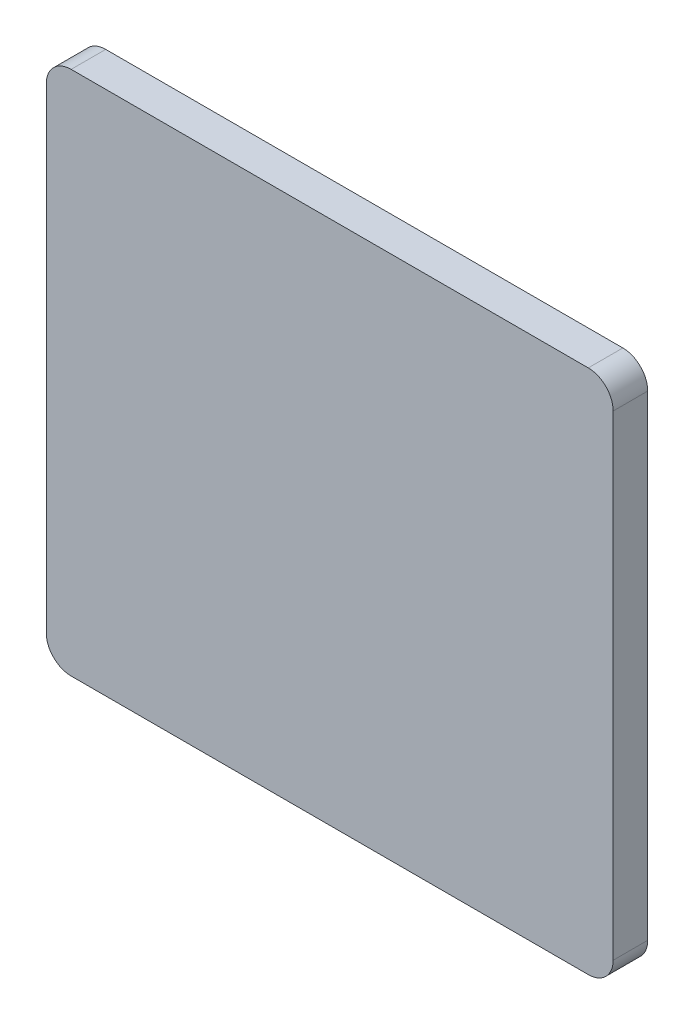
ISO-10303-21;
HEADER;
FILE_DESCRIPTION(('STEP AP214'),'2;1');
FILE_NAME('part.step','',(''),(''),'','','');
FILE_SCHEMA(('AUTOMOTIVE_DESIGN { 1 0 10303 214 1 1 1 1 }'));
ENDSEC;
DATA;
#1=APPLICATION_CONTEXT('core data for automotive mechanical design processes');
#2=APPLICATION_PROTOCOL_DEFINITION('international standard','automotive_design',2000,#1);
#3=PRODUCT_CONTEXT('',#1,'mechanical');
#4=PRODUCT('Part','Part','',(#3));
#5=PRODUCT_RELATED_PRODUCT_CATEGORY('part','',(#4));
#6=PRODUCT_DEFINITION_FORMATION('','',#4);
#7=PRODUCT_DEFINITION_CONTEXT('part definition',#1,'design');
#8=PRODUCT_DEFINITION('design','',#6,#7);
#9=PRODUCT_DEFINITION_SHAPE('','',#8);
#10=(LENGTH_UNIT() NAMED_UNIT(*) SI_UNIT(.MILLI.,.METRE.));
#11=(NAMED_UNIT(*) PLANE_ANGLE_UNIT() SI_UNIT($,.RADIAN.));
#12=(NAMED_UNIT(*) SI_UNIT($,.STERADIAN.) SOLID_ANGLE_UNIT());
#13=UNCERTAINTY_MEASURE_WITH_UNIT(LENGTH_MEASURE(1.E-05),#10,'distance_accuracy_value','');
#14=(GEOMETRIC_REPRESENTATION_CONTEXT(3) GLOBAL_UNCERTAINTY_ASSIGNED_CONTEXT((#13)) GLOBAL_UNIT_ASSIGNED_CONTEXT((#10,
#11,#12)) REPRESENTATION_CONTEXT('',''));
#15=CARTESIAN_POINT('',(0.,0.,0.));
#16=DIRECTION('',(0.,0.,1.));
#17=DIRECTION('',(1.,0.,0.));
#18=AXIS2_PLACEMENT_3D('',#15,#16,#17);
#19=CARTESIAN_POINT('',(-18.7,-17.2,0.));
#20=DIRECTION('',(0.,0.,1.));
#21=DIRECTION('',(1.,0.,0.));
#22=AXIS2_PLACEMENT_3D('',#19,#20,#21);
#23=PLANE('',#22);
#24=CARTESIAN_POINT('',(-18.7,-17.2,0.));
#25=DIRECTION('',(0.,0.,1.));
#26=DIRECTION('',(1.,0.,0.));
#27=AXIS2_PLACEMENT_3D('',#24,#25,#26);
#28=CIRCLE('',#27,1.8);
#29=CARTESIAN_POINT('',(-20.5,-17.2,0.));
#30=VERTEX_POINT('',#29);
#31=CARTESIAN_POINT('',(-18.7,-19.,0.));
#32=VERTEX_POINT('',#31);
#33=EDGE_CURVE('E156',#30,#32,#28,.T.);
#34=ORIENTED_EDGE('',*,*,#33,.F.);
#35=DIRECTION('',(0.,-1.,0.));
#36=VECTOR('',#35,1.);
#37=CARTESIAN_POINT('',(-20.5,17.2,0.));
#38=LINE('',#37,#36);
#39=CARTESIAN_POINT('',(-20.5,17.2,0.));
#40=VERTEX_POINT('',#39);
#41=EDGE_CURVE('E102',#40,#30,#38,.T.);
#42=ORIENTED_EDGE('',*,*,#41,.F.);
#43=CARTESIAN_POINT('',(-18.7,17.2,0.));
#44=DIRECTION('',(0.,0.,1.));
#45=DIRECTION('',(1.,0.,0.));
#46=AXIS2_PLACEMENT_3D('',#43,#44,#45);
#47=CIRCLE('',#46,1.8);
#48=CARTESIAN_POINT('',(-18.7,19.,0.));
#49=VERTEX_POINT('',#48);
#50=EDGE_CURVE('E166',#49,#40,#47,.T.);
#51=ORIENTED_EDGE('',*,*,#50,.F.);
#52=DIRECTION('',(-1.,0.,0.));
#53=VECTOR('',#52,1.);
#54=CARTESIAN_POINT('',(18.7,19.,0.));
#55=LINE('',#54,#53);
#56=CARTESIAN_POINT('',(18.7,19.,0.));
#57=VERTEX_POINT('',#56);
#58=EDGE_CURVE('E145',#57,#49,#55,.T.);
#59=ORIENTED_EDGE('',*,*,#58,.F.);
#60=CARTESIAN_POINT('',(18.7,17.2,0.));
#61=DIRECTION('',(0.,0.,1.));
#62=DIRECTION('',(1.,0.,0.));
#63=AXIS2_PLACEMENT_3D('',#60,#61,#62);
#64=CIRCLE('',#63,1.8);
#65=CARTESIAN_POINT('',(20.5,17.2,0.));
#66=VERTEX_POINT('',#65);
#67=EDGE_CURVE('E167',#66,#57,#64,.T.);
#68=ORIENTED_EDGE('',*,*,#67,.F.);
#69=DIRECTION('',(0.,1.,0.));
#70=VECTOR('',#69,1.);
#71=CARTESIAN_POINT('',(20.5,-17.2,0.));
#72=LINE('',#71,#70);
#73=CARTESIAN_POINT('',(20.5,-17.2,0.));
#74=VERTEX_POINT('',#73);
#75=EDGE_CURVE('E163',#74,#66,#72,.T.);
#76=ORIENTED_EDGE('',*,*,#75,.F.);
#77=CARTESIAN_POINT('',(18.7,-17.2,0.));
#78=DIRECTION('',(0.,0.,1.));
#79=DIRECTION('',(1.,0.,0.));
#80=AXIS2_PLACEMENT_3D('',#77,#78,#79);
#81=CIRCLE('',#80,1.8);
#82=CARTESIAN_POINT('',(18.7,-19.,0.));
#83=VERTEX_POINT('',#82);
#84=EDGE_CURVE('E165',#83,#74,#81,.T.);
#85=ORIENTED_EDGE('',*,*,#84,.F.);
#86=DIRECTION('',(1.,0.,0.));
#87=VECTOR('',#86,1.);
#88=CARTESIAN_POINT('',(-18.7,-19.,0.));
#89=LINE('',#88,#87);
#90=EDGE_CURVE('E157',#32,#83,#89,.T.);
#91=ORIENTED_EDGE('',*,*,#90,.F.);
#92=EDGE_LOOP('',(#34,#42,#51,#59,#68,#76,#85,#91));
#93=FACE_BOUND('',#92,.T.);
#94=CARTESIAN_POINT('',(-17.4,-15.9,0.));
#95=DIRECTION('',(0.,0.,1.));
#96=DIRECTION('',(1.,0.,0.));
#97=AXIS2_PLACEMENT_3D('',#94,#95,#96);
#98=CIRCLE('',#97,1.00000000000001);
#99=CARTESIAN_POINT('',(-18.4,-15.9,0.));
#100=VERTEX_POINT('',#99);
#101=CARTESIAN_POINT('',(-17.4,-16.9,0.));
#102=VERTEX_POINT('',#101);
#103=EDGE_CURVE('E64',#100,#102,#98,.T.);
#104=ORIENTED_EDGE('',*,*,#103,.T.);
#105=DIRECTION('',(1.,0.,0.));
#106=VECTOR('',#105,1.);
#107=CARTESIAN_POINT('',(-17.4,-16.9,0.));
#108=LINE('',#107,#106);
#109=CARTESIAN_POINT('',(17.4,-16.9,0.));
#110=VERTEX_POINT('',#109);
#111=EDGE_CURVE('E246',#102,#110,#108,.T.);
#112=ORIENTED_EDGE('',*,*,#111,.T.);
#113=CARTESIAN_POINT('',(17.4,-15.9,0.));
#114=DIRECTION('',(0.,0.,1.));
#115=DIRECTION('',(1.,0.,0.));
#116=AXIS2_PLACEMENT_3D('',#113,#114,#115);
#117=CIRCLE('',#116,1.00000000000001);
#118=CARTESIAN_POINT('',(18.4,-15.9,0.));
#119=VERTEX_POINT('',#118);
#120=EDGE_CURVE('E245',#110,#119,#117,.T.);
#121=ORIENTED_EDGE('',*,*,#120,.T.);
#122=DIRECTION('',(0.,1.,0.));
#123=VECTOR('',#122,1.);
#124=CARTESIAN_POINT('',(18.4,-15.9,0.));
#125=LINE('',#124,#123);
#126=CARTESIAN_POINT('',(18.4,15.9,0.));
#127=VERTEX_POINT('',#126);
#128=EDGE_CURVE('E238',#119,#127,#125,.T.);
#129=ORIENTED_EDGE('',*,*,#128,.T.);
#130=CARTESIAN_POINT('',(17.4,15.9,0.));
#131=DIRECTION('',(0.,0.,1.));
#132=DIRECTION('',(1.,0.,0.));
#133=AXIS2_PLACEMENT_3D('',#130,#131,#132);
#134=CIRCLE('',#133,1.00000000000001);
#135=CARTESIAN_POINT('',(17.4,16.9,0.));
#136=VERTEX_POINT('',#135);
#137=EDGE_CURVE('E240',#127,#136,#134,.T.);
#138=ORIENTED_EDGE('',*,*,#137,.T.);
#139=DIRECTION('',(-1.,0.,0.));
#140=VECTOR('',#139,1.);
#141=CARTESIAN_POINT('',(17.4,16.9,0.));
#142=LINE('',#141,#140);
#143=CARTESIAN_POINT('',(-17.4,16.9,0.));
#144=VERTEX_POINT('',#143);
#145=EDGE_CURVE('E233',#136,#144,#142,.T.);
#146=ORIENTED_EDGE('',*,*,#145,.T.);
#147=CARTESIAN_POINT('',(-17.4,15.9,0.));
#148=DIRECTION('',(0.,0.,1.));
#149=DIRECTION('',(1.,0.,0.));
#150=AXIS2_PLACEMENT_3D('',#147,#148,#149);
#151=CIRCLE('',#150,1.00000000000001);
#152=CARTESIAN_POINT('',(-18.4,15.9,0.));
#153=VERTEX_POINT('',#152);
#154=EDGE_CURVE('E231',#144,#153,#151,.T.);
#155=ORIENTED_EDGE('',*,*,#154,.T.);
#156=DIRECTION('',(0.,-1.,0.));
#157=VECTOR('',#156,1.);
#158=CARTESIAN_POINT('',(-18.4,15.9,0.));
#159=LINE('',#158,#157);
#160=EDGE_CURVE('E229',#153,#100,#159,.T.);
#161=ORIENTED_EDGE('',*,*,#160,.T.);
#162=EDGE_LOOP('',(#104,#112,#121,#129,#138,#146,#155,#161));
#163=FACE_BOUND('',#162,.T.);
#164=ADVANCED_FACE('F50',(#93,#163),#23,.F.);
#165=CARTESIAN_POINT('',(-18.7,-17.2,2.5));
#166=DIRECTION('',(0.,0.,-1.));
#167=DIRECTION('',(-1.,0.,0.));
#168=AXIS2_PLACEMENT_3D('',#165,#166,#167);
#169=CYLINDRICAL_SURFACE('',#168,1.8);
#170=ORIENTED_EDGE('',*,*,#33,.T.);
#171=DIRECTION('',(0.,0.,-1.));
#172=VECTOR('',#171,1.);
#173=CARTESIAN_POINT('',(-18.7,-19.,2.5));
#174=LINE('',#173,#172);
#175=CARTESIAN_POINT('',(-18.7,-19.,2.5));
#176=VERTEX_POINT('',#175);
#177=EDGE_CURVE('E11',#176,#32,#174,.T.);
#178=ORIENTED_EDGE('',*,*,#177,.F.);
#179=CARTESIAN_POINT('',(-18.7,-17.2,2.5));
#180=DIRECTION('',(0.,0.,1.));
#181=DIRECTION('',(1.,0.,0.));
#182=AXIS2_PLACEMENT_3D('',#179,#180,#181);
#183=CIRCLE('',#182,1.8);
#184=CARTESIAN_POINT('',(-20.5,-17.2,2.5));
#185=VERTEX_POINT('',#184);
#186=EDGE_CURVE('E174',#185,#176,#183,.T.);
#187=ORIENTED_EDGE('',*,*,#186,.F.);
#188=DIRECTION('',(0.,0.,-1.));
#189=VECTOR('',#188,1.);
#190=CARTESIAN_POINT('',(-20.5,-17.2,2.5));
#191=LINE('',#190,#189);
#192=EDGE_CURVE('E155',#185,#30,#191,.T.);
#193=ORIENTED_EDGE('',*,*,#192,.T.);
#194=EDGE_LOOP('',(#170,#178,#187,#193));
#195=FACE_BOUND('',#194,.T.);
#196=ADVANCED_FACE('F47',(#195),#169,.T.);
#197=CARTESIAN_POINT('',(-18.7,-19.,2.5));
#198=DIRECTION('',(0.,1.,0.));
#199=DIRECTION('',(0.,0.,1.));
#200=AXIS2_PLACEMENT_3D('',#197,#198,#199);
#201=PLANE('',#200);
#202=ORIENTED_EDGE('',*,*,#90,.T.);
#203=DIRECTION('',(0.,0.,-1.));
#204=VECTOR('',#203,1.);
#205=CARTESIAN_POINT('',(18.7,-19.,2.5));
#206=LINE('',#205,#204);
#207=CARTESIAN_POINT('',(18.7,-19.,2.5));
#208=VERTEX_POINT('',#207);
#209=EDGE_CURVE('E54',#208,#83,#206,.T.);
#210=ORIENTED_EDGE('',*,*,#209,.F.);
#211=DIRECTION('',(1.,0.,0.));
#212=VECTOR('',#211,1.);
#213=CARTESIAN_POINT('',(-18.7,-19.,2.5));
#214=LINE('',#213,#212);
#215=EDGE_CURVE('E115',#176,#208,#214,.T.);
#216=ORIENTED_EDGE('',*,*,#215,.F.);
#217=ORIENTED_EDGE('',*,*,#177,.T.);
#218=EDGE_LOOP('',(#202,#210,#216,#217));
#219=FACE_BOUND('',#218,.T.);
#220=ADVANCED_FACE('F349',(#219),#201,.F.);
#221=CARTESIAN_POINT('',(18.7,-17.2,2.5));
#222=DIRECTION('',(0.,0.,-1.));
#223=DIRECTION('',(-1.,0.,0.));
#224=AXIS2_PLACEMENT_3D('',#221,#222,#223);
#225=CYLINDRICAL_SURFACE('',#224,1.8);
#226=ORIENTED_EDGE('',*,*,#84,.T.);
#227=DIRECTION('',(0.,0.,-1.));
#228=VECTOR('',#227,1.);
#229=CARTESIAN_POINT('',(20.5,-17.2,2.5));
#230=LINE('',#229,#228);
#231=CARTESIAN_POINT('',(20.5,-17.2,2.5));
#232=VERTEX_POINT('',#231);
#233=EDGE_CURVE('E178',#232,#74,#230,.T.);
#234=ORIENTED_EDGE('',*,*,#233,.F.);
#235=CARTESIAN_POINT('',(18.7,-17.2,2.5));
#236=DIRECTION('',(0.,0.,1.));
#237=DIRECTION('',(1.,0.,0.));
#238=AXIS2_PLACEMENT_3D('',#235,#236,#237);
#239=CIRCLE('',#238,1.8);
#240=EDGE_CURVE('E189',#208,#232,#239,.T.);
#241=ORIENTED_EDGE('',*,*,#240,.F.);
#242=ORIENTED_EDGE('',*,*,#209,.T.);
#243=EDGE_LOOP('',(#226,#234,#241,#242));
#244=FACE_BOUND('',#243,.T.);
#245=ADVANCED_FACE('F183',(#244),#225,.T.);
#246=CARTESIAN_POINT('',(20.5,-17.2,2.5));
#247=DIRECTION('',(-1.,0.,0.));
#248=DIRECTION('',(0.,0.,1.));
#249=AXIS2_PLACEMENT_3D('',#246,#247,#248);
#250=PLANE('',#249);
#251=ORIENTED_EDGE('',*,*,#75,.T.);
#252=DIRECTION('',(0.,0.,-1.));
#253=VECTOR('',#252,1.);
#254=CARTESIAN_POINT('',(20.5,17.2,2.5));
#255=LINE('',#254,#253);
#256=CARTESIAN_POINT('',(20.5,17.2,2.5));
#257=VERTEX_POINT('',#256);
#258=EDGE_CURVE('E176',#257,#66,#255,.T.);
#259=ORIENTED_EDGE('',*,*,#258,.F.);
#260=DIRECTION('',(0.,1.,0.));
#261=VECTOR('',#260,1.);
#262=CARTESIAN_POINT('',(20.5,-17.2,2.5));
#263=LINE('',#262,#261);
#264=EDGE_CURVE('E200',#232,#257,#263,.T.);
#265=ORIENTED_EDGE('',*,*,#264,.F.);
#266=ORIENTED_EDGE('',*,*,#233,.T.);
#267=EDGE_LOOP('',(#251,#259,#265,#266));
#268=FACE_BOUND('',#267,.T.);
#269=ADVANCED_FACE('F195',(#268),#250,.F.);
#270=CARTESIAN_POINT('',(18.7,17.2,2.5));
#271=DIRECTION('',(0.,0.,-1.));
#272=DIRECTION('',(-1.,0.,0.));
#273=AXIS2_PLACEMENT_3D('',#270,#271,#272);
#274=CYLINDRICAL_SURFACE('',#273,1.8);
#275=ORIENTED_EDGE('',*,*,#67,.T.);
#276=DIRECTION('',(0.,0.,-1.));
#277=VECTOR('',#276,1.);
#278=CARTESIAN_POINT('',(18.7,19.,2.5));
#279=LINE('',#278,#277);
#280=CARTESIAN_POINT('',(18.7,19.,2.5));
#281=VERTEX_POINT('',#280);
#282=EDGE_CURVE('E150',#281,#57,#279,.T.);
#283=ORIENTED_EDGE('',*,*,#282,.F.);
#284=CARTESIAN_POINT('',(18.7,17.2,2.5));
#285=DIRECTION('',(0.,0.,1.));
#286=DIRECTION('',(1.,0.,0.));
#287=AXIS2_PLACEMENT_3D('',#284,#285,#286);
#288=CIRCLE('',#287,1.8);
#289=EDGE_CURVE('E133',#257,#281,#288,.T.);
#290=ORIENTED_EDGE('',*,*,#289,.F.);
#291=ORIENTED_EDGE('',*,*,#258,.T.);
#292=EDGE_LOOP('',(#275,#283,#290,#291));
#293=FACE_BOUND('',#292,.T.);
#294=ADVANCED_FACE('F196',(#293),#274,.T.);
#295=CARTESIAN_POINT('',(18.7,19.,2.5));
#296=DIRECTION('',(0.,-1.,0.));
#297=DIRECTION('',(0.,0.,-1.));
#298=AXIS2_PLACEMENT_3D('',#295,#296,#297);
#299=PLANE('',#298);
#300=ORIENTED_EDGE('',*,*,#58,.T.);
#301=DIRECTION('',(0.,0.,-1.));
#302=VECTOR('',#301,1.);
#303=CARTESIAN_POINT('',(-18.7,19.,2.5));
#304=LINE('',#303,#302);
#305=CARTESIAN_POINT('',(-18.7,19.,2.5));
#306=VERTEX_POINT('',#305);
#307=EDGE_CURVE('E143',#306,#49,#304,.T.);
#308=ORIENTED_EDGE('',*,*,#307,.F.);
#309=DIRECTION('',(-1.,0.,0.));
#310=VECTOR('',#309,1.);
#311=CARTESIAN_POINT('',(18.7,19.,2.5));
#312=LINE('',#311,#310);
#313=EDGE_CURVE('E126',#281,#306,#312,.T.);
#314=ORIENTED_EDGE('',*,*,#313,.F.);
#315=ORIENTED_EDGE('',*,*,#282,.T.);
#316=EDGE_LOOP('',(#300,#308,#314,#315));
#317=FACE_BOUND('',#316,.T.);
#318=ADVANCED_FACE('F142',(#317),#299,.F.);
#319=CARTESIAN_POINT('',(-18.7,17.2,2.5));
#320=DIRECTION('',(0.,0.,-1.));
#321=DIRECTION('',(-1.,0.,0.));
#322=AXIS2_PLACEMENT_3D('',#319,#320,#321);
#323=CYLINDRICAL_SURFACE('',#322,1.8);
#324=ORIENTED_EDGE('',*,*,#50,.T.);
#325=DIRECTION('',(0.,0.,-1.));
#326=VECTOR('',#325,1.);
#327=CARTESIAN_POINT('',(-20.5,17.2,2.5));
#328=LINE('',#327,#326);
#329=CARTESIAN_POINT('',(-20.5,17.2,2.5));
#330=VERTEX_POINT('',#329);
#331=EDGE_CURVE('E146',#330,#40,#328,.T.);
#332=ORIENTED_EDGE('',*,*,#331,.F.);
#333=CARTESIAN_POINT('',(-18.7,17.2,2.5));
#334=DIRECTION('',(0.,0.,1.));
#335=DIRECTION('',(1.,0.,0.));
#336=AXIS2_PLACEMENT_3D('',#333,#334,#335);
#337=CIRCLE('',#336,1.8);
#338=EDGE_CURVE('E134',#306,#330,#337,.T.);
#339=ORIENTED_EDGE('',*,*,#338,.F.);
#340=ORIENTED_EDGE('',*,*,#307,.T.);
#341=EDGE_LOOP('',(#324,#332,#339,#340));
#342=FACE_BOUND('',#341,.T.);
#343=ADVANCED_FACE('F147',(#342),#323,.T.);
#344=CARTESIAN_POINT('',(-20.5,17.2,2.5));
#345=DIRECTION('',(1.,0.,0.));
#346=DIRECTION('',(0.,0.,-1.));
#347=AXIS2_PLACEMENT_3D('',#344,#345,#346);
#348=PLANE('',#347);
#349=ORIENTED_EDGE('',*,*,#41,.T.);
#350=ORIENTED_EDGE('',*,*,#192,.F.);
#351=DIRECTION('',(0.,-1.,0.));
#352=VECTOR('',#351,1.);
#353=CARTESIAN_POINT('',(-20.5,17.2,2.5));
#354=LINE('',#353,#352);
#355=EDGE_CURVE('E72',#330,#185,#354,.T.);
#356=ORIENTED_EDGE('',*,*,#355,.F.);
#357=ORIENTED_EDGE('',*,*,#331,.T.);
#358=EDGE_LOOP('',(#349,#350,#356,#357));
#359=FACE_BOUND('',#358,.T.);
#360=ADVANCED_FACE('F351',(#359),#348,.F.);
#361=CARTESIAN_POINT('',(-18.7,-17.2,2.5));
#362=DIRECTION('',(0.,0.,1.));
#363=DIRECTION('',(1.,0.,0.));
#364=AXIS2_PLACEMENT_3D('',#361,#362,#363);
#365=PLANE('',#364);
#366=ORIENTED_EDGE('',*,*,#186,.T.);
#367=ORIENTED_EDGE('',*,*,#215,.T.);
#368=ORIENTED_EDGE('',*,*,#240,.T.);
#369=ORIENTED_EDGE('',*,*,#264,.T.);
#370=ORIENTED_EDGE('',*,*,#289,.T.);
#371=ORIENTED_EDGE('',*,*,#313,.T.);
#372=ORIENTED_EDGE('',*,*,#338,.T.);
#373=ORIENTED_EDGE('',*,*,#355,.T.);
#374=EDGE_LOOP('',(#366,#367,#368,#369,#370,#371,#372,#373));
#375=FACE_BOUND('',#374,.T.);
#376=ADVANCED_FACE('F128',(#375),#365,.T.);
#377=CARTESIAN_POINT('',(-17.4,-15.9,0.7));
#378=DIRECTION('',(0.,0.,-1.));
#379=DIRECTION('',(-1.,0.,0.));
#380=AXIS2_PLACEMENT_3D('',#377,#378,#379);
#381=CYLINDRICAL_SURFACE('',#380,1.00000000000001);
#382=ORIENTED_EDGE('',*,*,#103,.F.);
#383=DIRECTION('',(0.,0.,-1.));
#384=VECTOR('',#383,1.);
#385=CARTESIAN_POINT('',(-18.4,-15.9,0.7));
#386=LINE('',#385,#384);
#387=CARTESIAN_POINT('',(-18.4,-15.9,0.7));
#388=VERTEX_POINT('',#387);
#389=EDGE_CURVE('E221',#388,#100,#386,.T.);
#390=ORIENTED_EDGE('',*,*,#389,.F.);
#391=CARTESIAN_POINT('',(-17.4,-15.9,0.7));
#392=DIRECTION('',(0.,0.,1.));
#393=DIRECTION('',(1.,0.,0.));
#394=AXIS2_PLACEMENT_3D('',#391,#392,#393);
#395=CIRCLE('',#394,1.00000000000001);
#396=CARTESIAN_POINT('',(-17.4,-16.9,0.7));
#397=VERTEX_POINT('',#396);
#398=EDGE_CURVE('E228',#388,#397,#395,.T.);
#399=ORIENTED_EDGE('',*,*,#398,.T.);
#400=DIRECTION('',(0.,0.,-1.));
#401=VECTOR('',#400,1.);
#402=CARTESIAN_POINT('',(-17.4,-16.9,0.7));
#403=LINE('',#402,#401);
#404=EDGE_CURVE('E159',#397,#102,#403,.T.);
#405=ORIENTED_EDGE('',*,*,#404,.T.);
#406=EDGE_LOOP('',(#382,#390,#399,#405));
#407=FACE_BOUND('',#406,.T.);
#408=ADVANCED_FACE('F273',(#407),#381,.F.);
#409=CARTESIAN_POINT('',(-17.4,-16.9,0.7));
#410=DIRECTION('',(0.,1.,0.));
#411=DIRECTION('',(0.,0.,1.));
#412=AXIS2_PLACEMENT_3D('',#409,#410,#411);
#413=PLANE('',#412);
#414=ORIENTED_EDGE('',*,*,#111,.F.);
#415=ORIENTED_EDGE('',*,*,#404,.F.);
#416=DIRECTION('',(1.,0.,0.));
#417=VECTOR('',#416,1.);
#418=CARTESIAN_POINT('',(-17.4,-16.9,0.7));
#419=LINE('',#418,#417);
#420=CARTESIAN_POINT('',(17.4,-16.9,0.7));
#421=VERTEX_POINT('',#420);
#422=EDGE_CURVE('E270',#397,#421,#419,.T.);
#423=ORIENTED_EDGE('',*,*,#422,.T.);
#424=DIRECTION('',(0.,0.,-1.));
#425=VECTOR('',#424,1.);
#426=CARTESIAN_POINT('',(17.4,-16.9,0.7));
#427=LINE('',#426,#425);
#428=EDGE_CURVE('E206',#421,#110,#427,.T.);
#429=ORIENTED_EDGE('',*,*,#428,.T.);
#430=EDGE_LOOP('',(#414,#415,#423,#429));
#431=FACE_BOUND('',#430,.T.);
#432=ADVANCED_FACE('F285',(#431),#413,.T.);
#433=CARTESIAN_POINT('',(17.4,-15.9,0.7));
#434=DIRECTION('',(0.,0.,-1.));
#435=DIRECTION('',(-1.,0.,0.));
#436=AXIS2_PLACEMENT_3D('',#433,#434,#435);
#437=CYLINDRICAL_SURFACE('',#436,1.00000000000001);
#438=ORIENTED_EDGE('',*,*,#120,.F.);
#439=ORIENTED_EDGE('',*,*,#428,.F.);
#440=CARTESIAN_POINT('',(17.4,-15.9,0.7));
#441=DIRECTION('',(0.,0.,1.));
#442=DIRECTION('',(1.,0.,0.));
#443=AXIS2_PLACEMENT_3D('',#440,#441,#442);
#444=CIRCLE('',#443,1.00000000000001);
#445=CARTESIAN_POINT('',(18.4,-15.9,0.7));
#446=VERTEX_POINT('',#445);
#447=EDGE_CURVE('E262',#421,#446,#444,.T.);
#448=ORIENTED_EDGE('',*,*,#447,.T.);
#449=DIRECTION('',(0.,0.,-1.));
#450=VECTOR('',#449,1.);
#451=CARTESIAN_POINT('',(18.4,-15.9,0.7));
#452=LINE('',#451,#450);
#453=EDGE_CURVE('E207',#446,#119,#452,.T.);
#454=ORIENTED_EDGE('',*,*,#453,.T.);
#455=EDGE_LOOP('',(#438,#439,#448,#454));
#456=FACE_BOUND('',#455,.T.);
#457=ADVANCED_FACE('F329',(#456),#437,.F.);
#458=CARTESIAN_POINT('',(18.4,-15.9,0.7));
#459=DIRECTION('',(-1.,0.,0.));
#460=DIRECTION('',(0.,0.,1.));
#461=AXIS2_PLACEMENT_3D('',#458,#459,#460);
#462=PLANE('',#461);
#463=ORIENTED_EDGE('',*,*,#128,.F.);
#464=ORIENTED_EDGE('',*,*,#453,.F.);
#465=DIRECTION('',(0.,1.,0.));
#466=VECTOR('',#465,1.);
#467=CARTESIAN_POINT('',(18.4,-15.9,0.7));
#468=LINE('',#467,#466);
#469=CARTESIAN_POINT('',(18.4,15.9,0.7));
#470=VERTEX_POINT('',#469);
#471=EDGE_CURVE('E261',#446,#470,#468,.T.);
#472=ORIENTED_EDGE('',*,*,#471,.T.);
#473=DIRECTION('',(0.,0.,-1.));
#474=VECTOR('',#473,1.);
#475=CARTESIAN_POINT('',(18.4,15.9,0.7));
#476=LINE('',#475,#474);
#477=EDGE_CURVE('E215',#470,#127,#476,.T.);
#478=ORIENTED_EDGE('',*,*,#477,.T.);
#479=EDGE_LOOP('',(#463,#464,#472,#478));
#480=FACE_BOUND('',#479,.T.);
#481=ADVANCED_FACE('F334',(#480),#462,.T.);
#482=CARTESIAN_POINT('',(17.4,15.9,0.7));
#483=DIRECTION('',(0.,0.,-1.));
#484=DIRECTION('',(-1.,0.,0.));
#485=AXIS2_PLACEMENT_3D('',#482,#483,#484);
#486=CYLINDRICAL_SURFACE('',#485,1.00000000000001);
#487=ORIENTED_EDGE('',*,*,#137,.F.);
#488=ORIENTED_EDGE('',*,*,#477,.F.);
#489=CARTESIAN_POINT('',(17.4,15.9,0.7));
#490=DIRECTION('',(0.,0.,1.));
#491=DIRECTION('',(1.,0.,0.));
#492=AXIS2_PLACEMENT_3D('',#489,#490,#491);
#493=CIRCLE('',#492,1.00000000000001);
#494=CARTESIAN_POINT('',(17.4,16.9,0.7));
#495=VERTEX_POINT('',#494);
#496=EDGE_CURVE('E256',#470,#495,#493,.T.);
#497=ORIENTED_EDGE('',*,*,#496,.T.);
#498=DIRECTION('',(0.,0.,-1.));
#499=VECTOR('',#498,1.);
#500=CARTESIAN_POINT('',(17.4,16.9,0.7));
#501=LINE('',#500,#499);
#502=EDGE_CURVE('E214',#495,#136,#501,.T.);
#503=ORIENTED_EDGE('',*,*,#502,.T.);
#504=EDGE_LOOP('',(#487,#488,#497,#503));
#505=FACE_BOUND('',#504,.T.);
#506=ADVANCED_FACE('F333',(#505),#486,.F.);
#507=CARTESIAN_POINT('',(17.4,16.9,0.7));
#508=DIRECTION('',(0.,-1.,0.));
#509=DIRECTION('',(0.,0.,-1.));
#510=AXIS2_PLACEMENT_3D('',#507,#508,#509);
#511=PLANE('',#510);
#512=ORIENTED_EDGE('',*,*,#145,.F.);
#513=ORIENTED_EDGE('',*,*,#502,.F.);
#514=DIRECTION('',(-1.,0.,0.));
#515=VECTOR('',#514,1.);
#516=CARTESIAN_POINT('',(17.4,16.9,0.7));
#517=LINE('',#516,#515);
#518=CARTESIAN_POINT('',(-17.4,16.9,0.7));
#519=VERTEX_POINT('',#518);
#520=EDGE_CURVE('E254',#495,#519,#517,.T.);
#521=ORIENTED_EDGE('',*,*,#520,.T.);
#522=DIRECTION('',(0.,0.,-1.));
#523=VECTOR('',#522,1.);
#524=CARTESIAN_POINT('',(-17.4,16.9,0.7));
#525=LINE('',#524,#523);
#526=EDGE_CURVE('E217',#519,#144,#525,.T.);
#527=ORIENTED_EDGE('',*,*,#526,.T.);
#528=EDGE_LOOP('',(#512,#513,#521,#527));
#529=FACE_BOUND('',#528,.T.);
#530=ADVANCED_FACE('F313',(#529),#511,.T.);
#531=CARTESIAN_POINT('',(-17.4,15.9,0.7));
#532=DIRECTION('',(0.,0.,-1.));
#533=DIRECTION('',(-1.,0.,0.));
#534=AXIS2_PLACEMENT_3D('',#531,#532,#533);
#535=CYLINDRICAL_SURFACE('',#534,1.00000000000001);
#536=ORIENTED_EDGE('',*,*,#154,.F.);
#537=ORIENTED_EDGE('',*,*,#526,.F.);
#538=CARTESIAN_POINT('',(-17.4,15.9,0.7));
#539=DIRECTION('',(0.,0.,1.));
#540=DIRECTION('',(1.,0.,0.));
#541=AXIS2_PLACEMENT_3D('',#538,#539,#540);
#542=CIRCLE('',#541,1.00000000000001);
#543=CARTESIAN_POINT('',(-18.4,15.9,0.7));
#544=VERTEX_POINT('',#543);
#545=EDGE_CURVE('E252',#519,#544,#542,.T.);
#546=ORIENTED_EDGE('',*,*,#545,.T.);
#547=DIRECTION('',(0.,0.,-1.));
#548=VECTOR('',#547,1.);
#549=CARTESIAN_POINT('',(-18.4,15.9,0.7));
#550=LINE('',#549,#548);
#551=EDGE_CURVE('E222',#544,#153,#550,.T.);
#552=ORIENTED_EDGE('',*,*,#551,.T.);
#553=EDGE_LOOP('',(#536,#537,#546,#552));
#554=FACE_BOUND('',#553,.T.);
#555=ADVANCED_FACE('F303',(#554),#535,.F.);
#556=CARTESIAN_POINT('',(-18.4,15.9,0.7));
#557=DIRECTION('',(1.,0.,0.));
#558=DIRECTION('',(0.,0.,-1.));
#559=AXIS2_PLACEMENT_3D('',#556,#557,#558);
#560=PLANE('',#559);
#561=ORIENTED_EDGE('',*,*,#160,.F.);
#562=ORIENTED_EDGE('',*,*,#551,.F.);
#563=DIRECTION('',(0.,-1.,0.));
#564=VECTOR('',#563,1.);
#565=CARTESIAN_POINT('',(-18.4,15.9,0.7));
#566=LINE('',#565,#564);
#567=EDGE_CURVE('E227',#544,#388,#566,.T.);
#568=ORIENTED_EDGE('',*,*,#567,.T.);
#569=ORIENTED_EDGE('',*,*,#389,.T.);
#570=EDGE_LOOP('',(#561,#562,#568,#569));
#571=FACE_BOUND('',#570,.T.);
#572=ADVANCED_FACE('F306',(#571),#560,.T.);
#573=CARTESIAN_POINT('',(-17.4,-15.9,0.7));
#574=DIRECTION('',(0.,0.,1.));
#575=DIRECTION('',(1.,0.,0.));
#576=AXIS2_PLACEMENT_3D('',#573,#574,#575);
#577=PLANE('',#576);
#578=ORIENTED_EDGE('',*,*,#398,.F.);
#579=ORIENTED_EDGE('',*,*,#567,.F.);
#580=ORIENTED_EDGE('',*,*,#545,.F.);
#581=ORIENTED_EDGE('',*,*,#520,.F.);
#582=ORIENTED_EDGE('',*,*,#496,.F.);
#583=ORIENTED_EDGE('',*,*,#471,.F.);
#584=ORIENTED_EDGE('',*,*,#447,.F.);
#585=ORIENTED_EDGE('',*,*,#422,.F.);
#586=EDGE_LOOP('',(#578,#579,#580,#581,#582,#583,#584,#585));
#587=FACE_BOUND('',#586,.T.);
#588=ADVANCED_FACE('F317',(#587),#577,.F.);
#589=CLOSED_SHELL('',(#164,#196,#220,#245,#269,#294,#318,#343,#360,#376,#408,#432,#457,#481,
#506,#530,#555,#572,#588));
#590=MANIFOLD_SOLID_BREP('B2',#589);
#591=ADVANCED_BREP_SHAPE_REPRESENTATION('',(#18,#590),#14);
#592=SHAPE_DEFINITION_REPRESENTATION(#9,#591);
ENDSEC;
END-ISO-10303-21;
